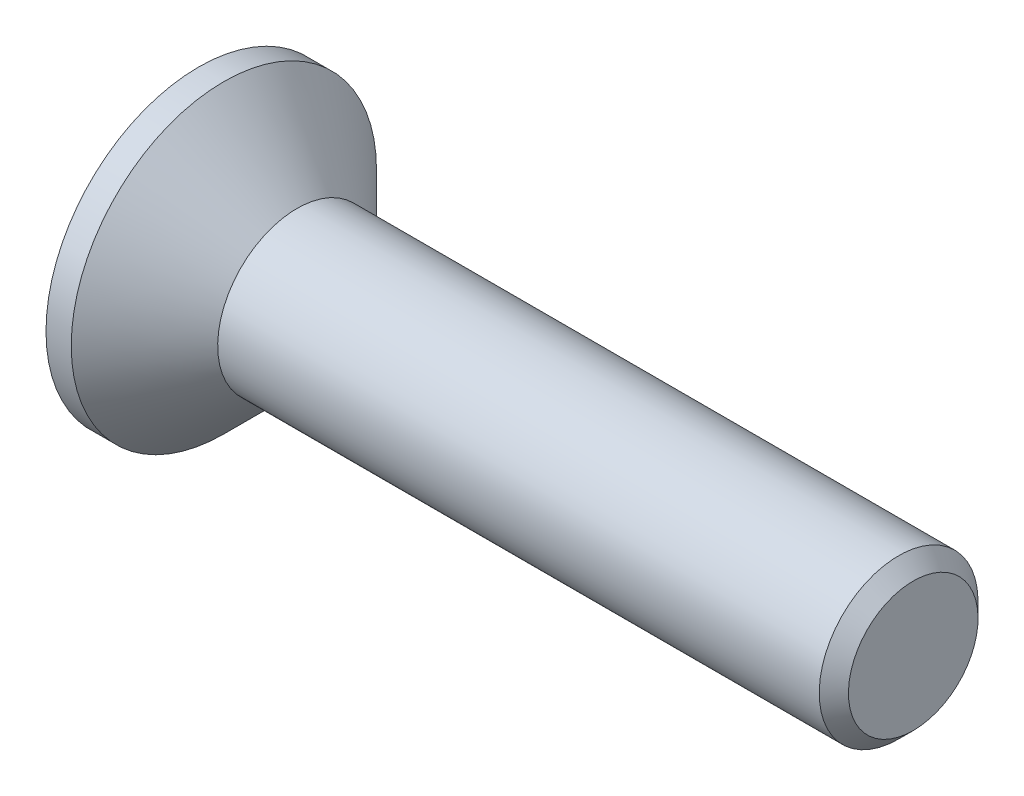
ISO-10303-21;
HEADER;
FILE_DESCRIPTION(('STEP AP214'),'2;1');
FILE_NAME('part.step','',(''),(''),'','','');
FILE_SCHEMA(('AUTOMOTIVE_DESIGN { 1 0 10303 214 1 1 1 1 }'));
ENDSEC;
DATA;
#1=APPLICATION_CONTEXT('core data for automotive mechanical design processes');
#2=APPLICATION_PROTOCOL_DEFINITION('international standard','automotive_design',2000,#1);
#3=PRODUCT_CONTEXT('',#1,'mechanical');
#4=PRODUCT('Part','Part','',(#3));
#5=PRODUCT_RELATED_PRODUCT_CATEGORY('part','',(#4));
#6=PRODUCT_DEFINITION_FORMATION('','',#4);
#7=PRODUCT_DEFINITION_CONTEXT('part definition',#1,'design');
#8=PRODUCT_DEFINITION('design','',#6,#7);
#9=PRODUCT_DEFINITION_SHAPE('','',#8);
#10=(LENGTH_UNIT() NAMED_UNIT(*) SI_UNIT(.MILLI.,.METRE.));
#11=(NAMED_UNIT(*) PLANE_ANGLE_UNIT() SI_UNIT($,.RADIAN.));
#12=(NAMED_UNIT(*) SI_UNIT($,.STERADIAN.) SOLID_ANGLE_UNIT());
#13=UNCERTAINTY_MEASURE_WITH_UNIT(LENGTH_MEASURE(1.E-05),#10,'distance_accuracy_value','');
#14=(GEOMETRIC_REPRESENTATION_CONTEXT(3) GLOBAL_UNCERTAINTY_ASSIGNED_CONTEXT((#13)) GLOBAL_UNIT_ASSIGNED_CONTEXT((#10,
#11,#12)) REPRESENTATION_CONTEXT('',''));
#15=CARTESIAN_POINT('',(0.,0.,0.));
#16=DIRECTION('',(0.,0.,1.));
#17=DIRECTION('',(1.,0.,0.));
#18=AXIS2_PLACEMENT_3D('',#15,#16,#17);
#19=CARTESIAN_POINT('',(45.,0.,0.));
#20=DIRECTION('',(-1.,0.,0.));
#21=DIRECTION('',(0.,-1.,0.));
#22=AXIS2_PLACEMENT_3D('',#19,#20,#21);
#23=PLANE('',#22);
#24=CARTESIAN_POINT('',(45.,0.,0.));
#25=DIRECTION('',(-1.,0.,0.));
#26=DIRECTION('',(0.,-1.,0.));
#27=AXIS2_PLACEMENT_3D('',#24,#25,#26);
#28=CIRCLE('',#27,4.079825);
#29=CARTESIAN_POINT('',(45.,-4.079825,0.));
#30=VERTEX_POINT('',#29);
#31=EDGE_CURVE('E10',#30,#30,#28,.F.);
#32=ORIENTED_EDGE('',*,*,#31,.T.);
#33=EDGE_LOOP('',(#32));
#34=FACE_BOUND('',#33,.T.);
#35=ADVANCED_FACE('F31',(#34),#23,.F.);
#36=CARTESIAN_POINT('',(6.18,0.,0.));
#37=DIRECTION('',(-1.,0.,0.));
#38=DIRECTION('',(0.,-1.,0.));
#39=AXIS2_PLACEMENT_3D('',#36,#37,#38);
#40=CYLINDRICAL_SURFACE('',#39,5.);
#41=CARTESIAN_POINT('',(44.079825,0.,0.));
#42=DIRECTION('',(-1.,0.,0.));
#43=DIRECTION('',(0.,-1.,0.));
#44=AXIS2_PLACEMENT_3D('',#41,#42,#43);
#45=CIRCLE('',#44,5.);
#46=CARTESIAN_POINT('',(44.079825,-5.,0.));
#47=VERTEX_POINT('',#46);
#48=EDGE_CURVE('E38',#47,#47,#45,.T.);
#49=ORIENTED_EDGE('',*,*,#48,.T.);
#50=EDGE_LOOP('',(#49));
#51=FACE_BOUND('',#50,.T.);
#52=CARTESIAN_POINT('',(6.19999999999999,0.,0.));
#53=DIRECTION('',(-1.,0.,0.));
#54=DIRECTION('',(0.,-1.,0.));
#55=AXIS2_PLACEMENT_3D('',#52,#53,#54);
#56=CIRCLE('',#55,5.);
#57=CARTESIAN_POINT('',(6.19999999999999,-5.,0.));
#58=VERTEX_POINT('',#57);
#59=EDGE_CURVE('E42',#58,#58,#56,.T.);
#60=ORIENTED_EDGE('',*,*,#59,.F.);
#61=EDGE_LOOP('',(#60));
#62=FACE_BOUND('',#61,.T.);
#63=ADVANCED_FACE('F66',(#51,#62),#40,.T.);
#64=CARTESIAN_POINT('',(6.19999999999999,0.,0.));
#65=DIRECTION('',(-1.,0.,0.));
#66=DIRECTION('',(0.,-1.,0.));
#67=AXIS2_PLACEMENT_3D('',#64,#65,#66);
#68=CONICAL_SURFACE('',#67,5.,0.785398163397448);
#69=CARTESIAN_POINT('',(1.58999999999998,0.,0.));
#70=DIRECTION('',(-1.,0.,0.));
#71=DIRECTION('',(0.,-1.,0.));
#72=AXIS2_PLACEMENT_3D('',#69,#70,#71);
#73=CIRCLE('',#72,9.61000000000001);
#74=CARTESIAN_POINT('',(1.58999999999998,-9.61000000000001,0.));
#75=VERTEX_POINT('',#74);
#76=EDGE_CURVE('E46',#75,#75,#73,.T.);
#77=ORIENTED_EDGE('',*,*,#76,.F.);
#78=EDGE_LOOP('',(#77));
#79=FACE_BOUND('',#78,.T.);
#80=ORIENTED_EDGE('',*,*,#59,.T.);
#81=EDGE_LOOP('',(#80));
#82=FACE_BOUND('',#81,.T.);
#83=ADVANCED_FACE('F60',(#79,#82),#68,.T.);
#84=CARTESIAN_POINT('',(6.18,0.,0.));
#85=DIRECTION('',(-1.,0.,0.));
#86=DIRECTION('',(0.,-1.,0.));
#87=AXIS2_PLACEMENT_3D('',#84,#85,#86);
#88=CYLINDRICAL_SURFACE('',#87,9.61000000000001);
#89=CARTESIAN_POINT('',(0.,0.,0.));
#90=DIRECTION('',(-1.,0.,0.));
#91=DIRECTION('',(0.,-1.,0.));
#92=AXIS2_PLACEMENT_3D('',#89,#90,#91);
#93=CIRCLE('',#92,9.61000000000001);
#94=CARTESIAN_POINT('',(0.,-9.61000000000001,0.));
#95=VERTEX_POINT('',#94);
#96=EDGE_CURVE('E51',#95,#95,#93,.T.);
#97=ORIENTED_EDGE('',*,*,#96,.F.);
#98=EDGE_LOOP('',(#97));
#99=FACE_BOUND('',#98,.T.);
#100=ORIENTED_EDGE('',*,*,#76,.T.);
#101=EDGE_LOOP('',(#100));
#102=FACE_BOUND('',#101,.T.);
#103=ADVANCED_FACE('F57',(#99,#102),#88,.T.);
#104=CARTESIAN_POINT('',(0.,9.61000000000001,0.));
#105=DIRECTION('',(1.,0.,0.));
#106=DIRECTION('',(0.,1.,0.));
#107=AXIS2_PLACEMENT_3D('',#104,#105,#106);
#108=PLANE('',#107);
#109=ORIENTED_EDGE('',*,*,#96,.T.);
#110=EDGE_LOOP('',(#109));
#111=FACE_BOUND('',#110,.T.);
#112=ADVANCED_FACE('F55',(#111),#108,.F.);
#113=CARTESIAN_POINT('',(44.079825,0.,0.));
#114=DIRECTION('',(-1.,0.,0.));
#115=DIRECTION('',(0.,-1.,0.));
#116=AXIS2_PLACEMENT_3D('',#113,#114,#115);
#117=CONICAL_SURFACE('',#116,5.,0.785398163397443);
#118=ORIENTED_EDGE('',*,*,#31,.F.);
#119=EDGE_LOOP('',(#118));
#120=FACE_BOUND('',#119,.T.);
#121=ORIENTED_EDGE('',*,*,#48,.F.);
#122=EDGE_LOOP('',(#121));
#123=FACE_BOUND('',#122,.T.);
#124=ADVANCED_FACE('F33',(#120,#123),#117,.T.);
#125=CLOSED_SHELL('',(#35,#63,#83,#103,#112,#124));
#126=MANIFOLD_SOLID_BREP('B2',#125);
#127=ADVANCED_BREP_SHAPE_REPRESENTATION('',(#18,#126),#14);
#128=SHAPE_DEFINITION_REPRESENTATION(#9,#127);
ENDSEC;
END-ISO-10303-21;
